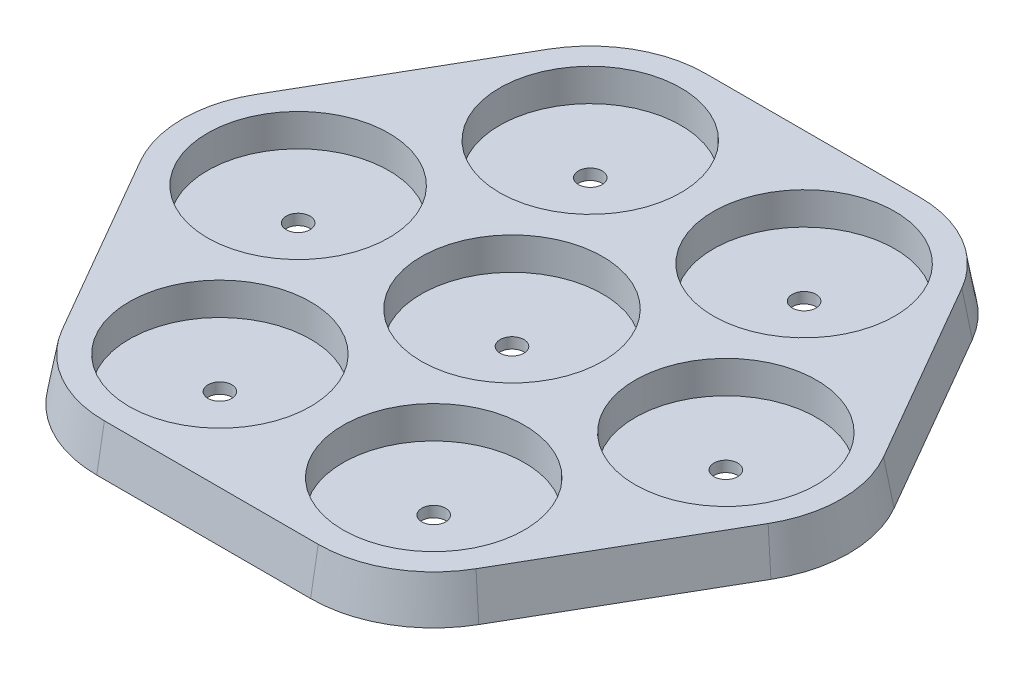
ISO-10303-21;
HEADER;
FILE_DESCRIPTION(('STEP AP214'),'2;1');
FILE_NAME('part.step','',(''),(''),'','','');
FILE_SCHEMA(('AUTOMOTIVE_DESIGN { 1 0 10303 214 1 1 1 1 }'));
ENDSEC;
DATA;
#1=APPLICATION_CONTEXT('core data for automotive mechanical design processes');
#2=APPLICATION_PROTOCOL_DEFINITION('international standard','automotive_design',2000,#1);
#3=PRODUCT_CONTEXT('',#1,'mechanical');
#4=PRODUCT('Part','Part','',(#3));
#5=PRODUCT_RELATED_PRODUCT_CATEGORY('part','',(#4));
#6=PRODUCT_DEFINITION_FORMATION('','',#4);
#7=PRODUCT_DEFINITION_CONTEXT('part definition',#1,'design');
#8=PRODUCT_DEFINITION('design','',#6,#7);
#9=PRODUCT_DEFINITION_SHAPE('','',#8);
#10=(LENGTH_UNIT() NAMED_UNIT(*) SI_UNIT(.MILLI.,.METRE.));
#11=(NAMED_UNIT(*) PLANE_ANGLE_UNIT() SI_UNIT($,.RADIAN.));
#12=(NAMED_UNIT(*) SI_UNIT($,.STERADIAN.) SOLID_ANGLE_UNIT());
#13=UNCERTAINTY_MEASURE_WITH_UNIT(LENGTH_MEASURE(1.E-05),#10,'distance_accuracy_value','');
#14=(GEOMETRIC_REPRESENTATION_CONTEXT(3) GLOBAL_UNCERTAINTY_ASSIGNED_CONTEXT((#13)) GLOBAL_UNIT_ASSIGNED_CONTEXT((#10,
#11,#12)) REPRESENTATION_CONTEXT('',''));
#15=CARTESIAN_POINT('',(0.,0.,0.));
#16=DIRECTION('',(0.,0.,1.));
#17=DIRECTION('',(1.,0.,0.));
#18=AXIS2_PLACEMENT_3D('',#15,#16,#17);
#19=CARTESIAN_POINT('',(-9.90000000000008,0.,17.1473029949318));
#20=DIRECTION('',(0.,1.,0.));
#21=DIRECTION('',(0.,0.,1.));
#22=AXIS2_PLACEMENT_3D('',#19,#20,#21);
#23=CYLINDRICAL_SURFACE('',#22,1.1);
#24=CARTESIAN_POINT('',(-9.90000000000008,0.,17.1473029949318));
#25=DIRECTION('',(0.,1.,0.));
#26=DIRECTION('',(0.,0.,1.));
#27=AXIS2_PLACEMENT_3D('',#24,#25,#26);
#28=CIRCLE('',#27,1.1);
#29=CARTESIAN_POINT('',(-9.90000000000008,0.,18.2473029949318));
#30=VERTEX_POINT('',#29);
#31=EDGE_CURVE('E195',#30,#30,#28,.T.);
#32=ORIENTED_EDGE('',*,*,#31,.F.);
#33=EDGE_LOOP('',(#32));
#34=FACE_BOUND('',#33,.T.);
#35=CARTESIAN_POINT('',(-9.90000000000008,1.,17.1473029949318));
#36=DIRECTION('',(0.,1.,0.));
#37=DIRECTION('',(0.,0.,1.));
#38=AXIS2_PLACEMENT_3D('',#35,#36,#37);
#39=CIRCLE('',#38,1.1);
#40=CARTESIAN_POINT('',(-9.90000000000008,1.,18.2473029949318));
#41=VERTEX_POINT('',#40);
#42=EDGE_CURVE('E914',#41,#41,#39,.T.);
#43=ORIENTED_EDGE('',*,*,#42,.T.);
#44=EDGE_LOOP('',(#43));
#45=FACE_BOUND('',#44,.T.);
#46=ADVANCED_FACE('F83',(#34,#45),#23,.F.);
#47=CARTESIAN_POINT('',(-19.7999999999998,0.,0.));
#48=DIRECTION('',(0.,1.,0.));
#49=DIRECTION('',(0.,0.,1.));
#50=AXIS2_PLACEMENT_3D('',#47,#48,#49);
#51=CYLINDRICAL_SURFACE('',#50,1.10000000000001);
#52=CARTESIAN_POINT('',(-19.7999999999998,0.,0.));
#53=DIRECTION('',(0.,1.,0.));
#54=DIRECTION('',(0.,0.,1.));
#55=AXIS2_PLACEMENT_3D('',#52,#53,#54);
#56=CIRCLE('',#55,1.10000000000001);
#57=CARTESIAN_POINT('',(-19.7999999999998,0.,1.10000000000001));
#58=VERTEX_POINT('',#57);
#59=EDGE_CURVE('E844',#58,#58,#56,.T.);
#60=ORIENTED_EDGE('',*,*,#59,.F.);
#61=EDGE_LOOP('',(#60));
#62=FACE_BOUND('',#61,.T.);
#63=CARTESIAN_POINT('',(-19.7999999999998,1.,0.));
#64=DIRECTION('',(0.,1.,0.));
#65=DIRECTION('',(0.,0.,1.));
#66=AXIS2_PLACEMENT_3D('',#63,#64,#65);
#67=CIRCLE('',#66,1.10000000000001);
#68=CARTESIAN_POINT('',(-19.7999999999998,1.,1.10000000000001));
#69=VERTEX_POINT('',#68);
#70=EDGE_CURVE('E834',#69,#69,#67,.T.);
#71=ORIENTED_EDGE('',*,*,#70,.T.);
#72=EDGE_LOOP('',(#71));
#73=FACE_BOUND('',#72,.T.);
#74=ADVANCED_FACE('F354',(#62,#73),#51,.F.);
#75=CARTESIAN_POINT('',(-29.6999999999994,0.,-17.1473029949317));
#76=DIRECTION('',(0.,1.,0.));
#77=DIRECTION('',(0.,0.,1.));
#78=AXIS2_PLACEMENT_3D('',#75,#76,#77);
#79=CYLINDRICAL_SURFACE('',#78,1.1);
#80=CARTESIAN_POINT('',(-29.6999999999994,0.,-17.1473029949317));
#81=DIRECTION('',(0.,1.,0.));
#82=DIRECTION('',(0.,0.,1.));
#83=AXIS2_PLACEMENT_3D('',#80,#81,#82);
#84=CIRCLE('',#83,1.1);
#85=CARTESIAN_POINT('',(-29.6999999999994,0.,-16.0473029949317));
#86=VERTEX_POINT('',#85);
#87=EDGE_CURVE('E848',#86,#86,#84,.T.);
#88=ORIENTED_EDGE('',*,*,#87,.F.);
#89=EDGE_LOOP('',(#88));
#90=FACE_BOUND('',#89,.T.);
#91=CARTESIAN_POINT('',(-29.6999999999994,1.,-17.1473029949317));
#92=DIRECTION('',(0.,1.,0.));
#93=DIRECTION('',(0.,0.,1.));
#94=AXIS2_PLACEMENT_3D('',#91,#92,#93);
#95=CIRCLE('',#94,1.1);
#96=CARTESIAN_POINT('',(-29.6999999999994,1.,-16.0473029949317));
#97=VERTEX_POINT('',#96);
#98=EDGE_CURVE('E827',#97,#97,#95,.T.);
#99=ORIENTED_EDGE('',*,*,#98,.T.);
#100=EDGE_LOOP('',(#99));
#101=FACE_BOUND('',#100,.T.);
#102=ADVANCED_FACE('F360',(#90,#101),#79,.F.);
#103=CARTESIAN_POINT('',(0.,0.,0.));
#104=DIRECTION('',(0.,1.,0.));
#105=DIRECTION('',(0.,0.,1.));
#106=AXIS2_PLACEMENT_3D('',#103,#104,#105);
#107=CYLINDRICAL_SURFACE('',#106,1.1);
#108=CARTESIAN_POINT('',(0.,0.,0.));
#109=DIRECTION('',(0.,1.,0.));
#110=DIRECTION('',(0.,0.,1.));
#111=AXIS2_PLACEMENT_3D('',#108,#109,#110);
#112=CIRCLE('',#111,1.1);
#113=CARTESIAN_POINT('',(0.,0.,1.1));
#114=VERTEX_POINT('',#113);
#115=EDGE_CURVE('E199',#114,#114,#112,.T.);
#116=ORIENTED_EDGE('',*,*,#115,.F.);
#117=EDGE_LOOP('',(#116));
#118=FACE_BOUND('',#117,.T.);
#119=CARTESIAN_POINT('',(0.,1.,0.));
#120=DIRECTION('',(0.,1.,0.));
#121=DIRECTION('',(0.,0.,1.));
#122=AXIS2_PLACEMENT_3D('',#119,#120,#121);
#123=CIRCLE('',#122,1.1);
#124=CARTESIAN_POINT('',(0.,1.,1.1));
#125=VERTEX_POINT('',#124);
#126=EDGE_CURVE('E889',#125,#125,#123,.T.);
#127=ORIENTED_EDGE('',*,*,#126,.T.);
#128=EDGE_LOOP('',(#127));
#129=FACE_BOUND('',#128,.T.);
#130=ADVANCED_FACE('F555',(#118,#129),#107,.F.);
#131=CARTESIAN_POINT('',(-29.6999999999999,0.,17.1473029949318));
#132=DIRECTION('',(0.,1.,0.));
#133=DIRECTION('',(0.,0.,1.));
#134=AXIS2_PLACEMENT_3D('',#131,#132,#133);
#135=CYLINDRICAL_SURFACE('',#134,1.1);
#136=CARTESIAN_POINT('',(-29.6999999999999,0.,17.1473029949318));
#137=DIRECTION('',(0.,1.,0.));
#138=DIRECTION('',(0.,0.,1.));
#139=AXIS2_PLACEMENT_3D('',#136,#137,#138);
#140=CIRCLE('',#139,1.1);
#141=CARTESIAN_POINT('',(-29.6999999999999,0.,18.2473029949318));
#142=VERTEX_POINT('',#141);
#143=EDGE_CURVE('E859',#142,#142,#140,.T.);
#144=ORIENTED_EDGE('',*,*,#143,.F.);
#145=EDGE_LOOP('',(#144));
#146=FACE_BOUND('',#145,.T.);
#147=CARTESIAN_POINT('',(-29.6999999999999,1.,17.1473029949318));
#148=DIRECTION('',(0.,1.,0.));
#149=DIRECTION('',(0.,0.,1.));
#150=AXIS2_PLACEMENT_3D('',#147,#148,#149);
#151=CIRCLE('',#150,1.1);
#152=CARTESIAN_POINT('',(-29.6999999999999,1.,18.2473029949318));
#153=VERTEX_POINT('',#152);
#154=EDGE_CURVE('E872',#153,#153,#151,.T.);
#155=ORIENTED_EDGE('',*,*,#154,.T.);
#156=EDGE_LOOP('',(#155));
#157=FACE_BOUND('',#156,.T.);
#158=ADVANCED_FACE('F367',(#146,#157),#135,.F.);
#159=CARTESIAN_POINT('',(-39.5999999999999,0.,-2.72581957005969E-13));
#160=DIRECTION('',(0.,1.,0.));
#161=DIRECTION('',(0.,0.,1.));
#162=AXIS2_PLACEMENT_3D('',#159,#160,#161);
#163=CYLINDRICAL_SURFACE('',#162,1.10000000000001);
#164=CARTESIAN_POINT('',(-39.5999999999999,0.,-2.72581957005969E-13));
#165=DIRECTION('',(0.,1.,0.));
#166=DIRECTION('',(0.,0.,1.));
#167=AXIS2_PLACEMENT_3D('',#164,#165,#166);
#168=CIRCLE('',#167,1.10000000000001);
#169=CARTESIAN_POINT('',(-39.5999999999999,0.,1.09999999999974));
#170=VERTEX_POINT('',#169);
#171=EDGE_CURVE('E855',#170,#170,#168,.T.);
#172=ORIENTED_EDGE('',*,*,#171,.F.);
#173=EDGE_LOOP('',(#172));
#174=FACE_BOUND('',#173,.T.);
#175=CARTESIAN_POINT('',(-39.5999999999999,1.,-2.72581957005969E-13));
#176=DIRECTION('',(0.,1.,0.));
#177=DIRECTION('',(0.,0.,1.));
#178=AXIS2_PLACEMENT_3D('',#175,#176,#177);
#179=CIRCLE('',#178,1.10000000000001);
#180=CARTESIAN_POINT('',(-39.5999999999999,1.,1.09999999999974));
#181=VERTEX_POINT('',#180);
#182=EDGE_CURVE('E825',#181,#181,#179,.T.);
#183=ORIENTED_EDGE('',*,*,#182,.T.);
#184=EDGE_LOOP('',(#183));
#185=FACE_BOUND('',#184,.T.);
#186=ADVANCED_FACE('F571',(#174,#185),#163,.F.);
#187=CARTESIAN_POINT('',(-9.89999999999992,0.,-17.1473029949316));
#188=DIRECTION('',(0.,1.,0.));
#189=DIRECTION('',(0.,0.,1.));
#190=AXIS2_PLACEMENT_3D('',#187,#188,#189);
#191=CYLINDRICAL_SURFACE('',#190,1.1);
#192=CARTESIAN_POINT('',(-9.89999999999992,0.,-17.1473029949316));
#193=DIRECTION('',(0.,1.,0.));
#194=DIRECTION('',(0.,0.,1.));
#195=AXIS2_PLACEMENT_3D('',#192,#193,#194);
#196=CIRCLE('',#195,1.1);
#197=CARTESIAN_POINT('',(-9.89999999999992,0.,-16.0473029949316));
#198=VERTEX_POINT('',#197);
#199=EDGE_CURVE('E803',#198,#198,#196,.T.);
#200=ORIENTED_EDGE('',*,*,#199,.F.);
#201=EDGE_LOOP('',(#200));
#202=FACE_BOUND('',#201,.T.);
#203=CARTESIAN_POINT('',(-9.89999999999992,1.,-17.1473029949316));
#204=DIRECTION('',(0.,1.,0.));
#205=DIRECTION('',(0.,0.,1.));
#206=AXIS2_PLACEMENT_3D('',#203,#204,#205);
#207=CIRCLE('',#206,1.1);
#208=CARTESIAN_POINT('',(-9.89999999999992,1.,-16.0473029949316));
#209=VERTEX_POINT('',#208);
#210=EDGE_CURVE('E806',#209,#209,#207,.T.);
#211=ORIENTED_EDGE('',*,*,#210,.T.);
#212=EDGE_LOOP('',(#211));
#213=FACE_BOUND('',#212,.T.);
#214=ADVANCED_FACE('F378',(#202,#213),#191,.F.);
#215=CARTESIAN_POINT('',(-39.5999999999999,0.,-2.72581957005969E-13));
#216=DIRECTION('',(0.,-1.,0.));
#217=DIRECTION('',(0.,0.,1.));
#218=AXIS2_PLACEMENT_3D('',#215,#216,#217);
#219=CONICAL_SURFACE('',#218,11.4,0.174532925199433);
#220=CARTESIAN_POINT('',(-39.5999999999999,0.,-2.72581957005969E-13));
#221=DIRECTION('',(0.,1.,0.));
#222=DIRECTION('',(0.,0.,1.));
#223=AXIS2_PLACEMENT_3D('',#220,#221,#222);
#224=CIRCLE('',#223,11.4);
#225=CARTESIAN_POINT('',(-49.4726896031423,0.,-5.70000000000059));
#226=VERTEX_POINT('',#225);
#227=CARTESIAN_POINT('',(-49.4726896031425,0.,5.69999999999964));
#228=VERTEX_POINT('',#227);
#229=EDGE_CURVE('E178',#226,#228,#224,.T.);
#230=ORIENTED_EDGE('',*,*,#229,.T.);
#231=DIRECTION('',(-0.150383733180436,-0.984807753012208,0.086824088833464));
#232=VECTOR('',#231,1.);
#233=CARTESIAN_POINT('',(-49.4726896031425,0.,5.69999999999963));
#234=LINE('',#233,#232);
#235=CARTESIAN_POINT('',(-48.8618750244779,4.,5.3473460385827));
#236=VERTEX_POINT('',#235);
#237=EDGE_CURVE('E12',#236,#228,#234,.T.);
#238=ORIENTED_EDGE('',*,*,#237,.F.);
#239=CARTESIAN_POINT('',(-39.5999999999999,4.,-2.72581957005969E-13));
#240=DIRECTION('',(0.,1.,0.));
#241=DIRECTION('',(0.,0.,1.));
#242=AXIS2_PLACEMENT_3D('',#239,#240,#241);
#243=CIRCLE('',#242,10.6946920771662);
#244=CARTESIAN_POINT('',(-48.8618750244777,4.,-5.34734603858365));
#245=VERTEX_POINT('',#244);
#246=EDGE_CURVE('E235',#245,#236,#243,.T.);
#247=ORIENTED_EDGE('',*,*,#246,.F.);
#248=DIRECTION('',(-0.150383733180433,-0.984807753012208,-0.0868240888334702));
#249=VECTOR('',#248,1.);
#250=CARTESIAN_POINT('',(-49.4726896031423,0.,-5.7000000000006));
#251=LINE('',#250,#249);
#252=EDGE_CURVE('E193',#245,#226,#251,.T.);
#253=ORIENTED_EDGE('',*,*,#252,.T.);
#254=EDGE_LOOP('',(#230,#238,#247,#253));
#255=FACE_BOUND('',#254,.T.);
#256=ADVANCED_FACE('F192',(#255),#219,.T.);
#257=CARTESIAN_POINT('',(-39.5726896031427,0.,22.8473029949315));
#258=DIRECTION('',(-0.852868531952448,0.173648177666931,0.492403876506096));
#259=DIRECTION('',(0.499999999999992,0.,0.866025403784443));
#260=AXIS2_PLACEMENT_3D('',#257,#258,#259);
#261=PLANE('',#260);
#262=DIRECTION('',(0.499999999999992,0.,0.866025403784443));
#263=VECTOR('',#262,1.);
#264=CARTESIAN_POINT('',(-39.5726896031427,0.,22.8473029949315));
#265=LINE('',#264,#263);
#266=CARTESIAN_POINT('',(-39.5726896031426,0.,22.8473029949318));
#267=VERTEX_POINT('',#266);
#268=EDGE_CURVE('E174',#228,#267,#265,.T.);
#269=ORIENTED_EDGE('',*,*,#268,.T.);
#270=DIRECTION('',(-0.150383733180436,-0.984807753012208,0.086824088833464));
#271=VECTOR('',#270,1.);
#272=CARTESIAN_POINT('',(-39.5726896031426,0.,22.8473029949318));
#273=LINE('',#272,#271);
#274=CARTESIAN_POINT('',(-38.961875024478,4.,22.4946490335148));
#275=VERTEX_POINT('',#274);
#276=EDGE_CURVE('E93',#275,#267,#273,.T.);
#277=ORIENTED_EDGE('',*,*,#276,.F.);
#278=DIRECTION('',(-0.499999999999992,0.,-0.866025403784443));
#279=VECTOR('',#278,1.);
#280=CARTESIAN_POINT('',(-38.9618750244782,4.,22.4946490335146));
#281=LINE('',#280,#279);
#282=EDGE_CURVE('E188',#236,#275,#281,.F.);
#283=ORIENTED_EDGE('',*,*,#282,.F.);
#284=ORIENTED_EDGE('',*,*,#237,.T.);
#285=EDGE_LOOP('',(#269,#277,#283,#284));
#286=FACE_BOUND('',#285,.T.);
#287=ADVANCED_FACE('F85',(#286),#261,.T.);
#288=CARTESIAN_POINT('',(-29.6999999999999,0.,17.1473029949318));
#289=DIRECTION('',(0.,-1.,0.));
#290=DIRECTION('',(0.,0.,1.));
#291=AXIS2_PLACEMENT_3D('',#288,#289,#290);
#292=CONICAL_SURFACE('',#291,11.4,0.174532925199433);
#293=CARTESIAN_POINT('',(-29.6999999999999,0.,17.1473029949318));
#294=DIRECTION('',(0.,1.,0.));
#295=DIRECTION('',(0.,0.,1.));
#296=AXIS2_PLACEMENT_3D('',#293,#294,#295);
#297=CIRCLE('',#296,11.4);
#298=CARTESIAN_POINT('',(-29.6999999999999,0.,28.5473029949318));
#299=VERTEX_POINT('',#298);
#300=EDGE_CURVE('E181',#267,#299,#297,.T.);
#301=ORIENTED_EDGE('',*,*,#300,.T.);
#302=DIRECTION('',(0.,-0.984807753012208,0.173648177666931));
#303=VECTOR('',#302,1.);
#304=CARTESIAN_POINT('',(-29.6999999999999,0.,28.5473029949318));
#305=LINE('',#304,#303);
#306=CARTESIAN_POINT('',(-29.6999999999999,4.,27.841995072098));
#307=VERTEX_POINT('',#306);
#308=EDGE_CURVE('E266',#307,#299,#305,.T.);
#309=ORIENTED_EDGE('',*,*,#308,.F.);
#310=CARTESIAN_POINT('',(-29.6999999999999,4.,17.1473029949318));
#311=DIRECTION('',(0.,1.,0.));
#312=DIRECTION('',(0.,0.,1.));
#313=AXIS2_PLACEMENT_3D('',#310,#311,#312);
#314=CIRCLE('',#313,10.6946920771661);
#315=EDGE_CURVE('E275',#275,#307,#314,.T.);
#316=ORIENTED_EDGE('',*,*,#315,.F.);
#317=ORIENTED_EDGE('',*,*,#276,.T.);
#318=EDGE_LOOP('',(#301,#309,#316,#317));
#319=FACE_BOUND('',#318,.T.);
#320=ADVANCED_FACE('F321',(#319),#292,.T.);
#321=CARTESIAN_POINT('',(0.,0.,28.5473029949318));
#322=DIRECTION('',(0.,0.173648177666931,0.984807753012208));
#323=DIRECTION('',(0.,-0.984807753012208,0.173648177666931));
#324=AXIS2_PLACEMENT_3D('',#321,#322,#323);
#325=PLANE('',#324);
#326=DIRECTION('',(-1.,0.,0.));
#327=VECTOR('',#326,1.);
#328=CARTESIAN_POINT('',(0.,0.,28.5473029949318));
#329=LINE('',#328,#327);
#330=CARTESIAN_POINT('',(-9.90000000000008,0.,28.5473029949318));
#331=VERTEX_POINT('',#330);
#332=EDGE_CURVE('E205',#331,#299,#329,.T.);
#333=ORIENTED_EDGE('',*,*,#332,.F.);
#334=DIRECTION('',(0.,-0.984807753012208,0.173648177666931));
#335=VECTOR('',#334,1.);
#336=CARTESIAN_POINT('',(-9.90000000000008,0.,28.5473029949318));
#337=LINE('',#336,#335);
#338=CARTESIAN_POINT('',(-9.90000000000008,4.,27.841995072098));
#339=VERTEX_POINT('',#338);
#340=EDGE_CURVE('E263',#339,#331,#337,.T.);
#341=ORIENTED_EDGE('',*,*,#340,.F.);
#342=DIRECTION('',(-1.,0.,0.));
#343=VECTOR('',#342,1.);
#344=CARTESIAN_POINT('',(0.,4.,27.841995072098));
#345=LINE('',#344,#343);
#346=EDGE_CURVE('E278',#339,#307,#345,.T.);
#347=ORIENTED_EDGE('',*,*,#346,.T.);
#348=ORIENTED_EDGE('',*,*,#308,.T.);
#349=EDGE_LOOP('',(#333,#341,#347,#348));
#350=FACE_BOUND('',#349,.T.);
#351=ADVANCED_FACE('F324',(#350),#325,.T.);
#352=CARTESIAN_POINT('',(-9.90000000000008,0.,17.1473029949318));
#353=DIRECTION('',(0.,-1.,0.));
#354=DIRECTION('',(0.,0.,1.));
#355=AXIS2_PLACEMENT_3D('',#352,#353,#354);
#356=CONICAL_SURFACE('',#355,11.4,0.174532925199433);
#357=CARTESIAN_POINT('',(-9.90000000000008,0.,17.1473029949318));
#358=DIRECTION('',(0.,1.,0.));
#359=DIRECTION('',(0.,0.,1.));
#360=AXIS2_PLACEMENT_3D('',#357,#358,#359);
#361=CIRCLE('',#360,11.4);
#362=CARTESIAN_POINT('',(-0.0273103968575087,0.,22.8473029949319));
#363=VERTEX_POINT('',#362);
#364=EDGE_CURVE('E208',#331,#363,#361,.T.);
#365=ORIENTED_EDGE('',*,*,#364,.T.);
#366=DIRECTION('',(0.150383733180435,-0.984807753012208,0.0868240888334661));
#367=VECTOR('',#366,1.);
#368=CARTESIAN_POINT('',(-0.0273103968575079,0.,22.8473029949319));
#369=LINE('',#368,#367);
#370=CARTESIAN_POINT('',(-0.638124975522065,4.,22.494649033515));
#371=VERTEX_POINT('',#370);
#372=EDGE_CURVE('E260',#371,#363,#369,.T.);
#373=ORIENTED_EDGE('',*,*,#372,.F.);
#374=CARTESIAN_POINT('',(-9.90000000000008,4.,17.1473029949318));
#375=DIRECTION('',(0.,1.,0.));
#376=DIRECTION('',(0.,0.,1.));
#377=AXIS2_PLACEMENT_3D('',#374,#375,#376);
#378=CIRCLE('',#377,10.6946920771661);
#379=EDGE_CURVE('E282',#339,#371,#378,.T.);
#380=ORIENTED_EDGE('',*,*,#379,.F.);
#381=ORIENTED_EDGE('',*,*,#340,.T.);
#382=EDGE_LOOP('',(#365,#373,#380,#381));
#383=FACE_BOUND('',#382,.T.);
#384=ADVANCED_FACE('F329',(#383),#356,.T.);
#385=CARTESIAN_POINT('',(9.87268960314258,0.,5.70000000000005));
#386=DIRECTION('',(0.852868531952441,0.173648177666931,0.492403876506108));
#387=DIRECTION('',(0.500000000000004,0.,-0.866025403784436));
#388=AXIS2_PLACEMENT_3D('',#385,#386,#387);
#389=PLANE('',#388);
#390=DIRECTION('',(-0.500000000000004,0.,0.866025403784436));
#391=VECTOR('',#390,1.);
#392=CARTESIAN_POINT('',(9.87268960314258,0.,5.70000000000005));
#393=LINE('',#392,#391);
#394=CARTESIAN_POINT('',(9.87268960314258,0.,5.70000000000005));
#395=VERTEX_POINT('',#394);
#396=EDGE_CURVE('E212',#395,#363,#393,.T.);
#397=ORIENTED_EDGE('',*,*,#396,.F.);
#398=DIRECTION('',(0.150383733180435,-0.984807753012208,0.0868240888334661));
#399=VECTOR('',#398,1.);
#400=CARTESIAN_POINT('',(9.87268960314258,0.,5.70000000000004));
#401=LINE('',#400,#399);
#402=CARTESIAN_POINT('',(9.26187502447802,4.,5.34734603858311));
#403=VERTEX_POINT('',#402);
#404=EDGE_CURVE('E257',#403,#395,#401,.T.);
#405=ORIENTED_EDGE('',*,*,#404,.F.);
#406=DIRECTION('',(-0.500000000000004,0.,0.866025403784436));
#407=VECTOR('',#406,1.);
#408=CARTESIAN_POINT('',(9.26187502447802,4.,5.34734603858312));
#409=LINE('',#408,#407);
#410=EDGE_CURVE('E285',#403,#371,#409,.T.);
#411=ORIENTED_EDGE('',*,*,#410,.T.);
#412=ORIENTED_EDGE('',*,*,#372,.T.);
#413=EDGE_LOOP('',(#397,#405,#411,#412));
#414=FACE_BOUND('',#413,.T.);
#415=ADVANCED_FACE('F333',(#414),#389,.T.);
#416=CARTESIAN_POINT('',(0.,0.,0.));
#417=DIRECTION('',(0.,-1.,0.));
#418=DIRECTION('',(0.,0.,1.));
#419=AXIS2_PLACEMENT_3D('',#416,#417,#418);
#420=CONICAL_SURFACE('',#419,11.4,0.174532925199433);
#421=CARTESIAN_POINT('',(0.,0.,0.));
#422=DIRECTION('',(0.,1.,0.));
#423=DIRECTION('',(0.,0.,1.));
#424=AXIS2_PLACEMENT_3D('',#421,#422,#423);
#425=CIRCLE('',#424,11.4);
#426=CARTESIAN_POINT('',(9.87268960314257,0.,-5.70000000000005));
#427=VERTEX_POINT('',#426);
#428=EDGE_CURVE('E216',#395,#427,#425,.T.);
#429=ORIENTED_EDGE('',*,*,#428,.T.);
#430=DIRECTION('',(0.150383733180435,-0.984807753012208,-0.0868240888334661));
#431=VECTOR('',#430,1.);
#432=CARTESIAN_POINT('',(9.87268960314257,0.,-5.70000000000005));
#433=LINE('',#432,#431);
#434=CARTESIAN_POINT('',(9.26187502447801,4.,-5.34734603858311));
#435=VERTEX_POINT('',#434);
#436=EDGE_CURVE('E254',#435,#427,#433,.T.);
#437=ORIENTED_EDGE('',*,*,#436,.F.);
#438=CARTESIAN_POINT('',(0.,4.,0.));
#439=DIRECTION('',(0.,1.,0.));
#440=DIRECTION('',(0.,0.,1.));
#441=AXIS2_PLACEMENT_3D('',#438,#439,#440);
#442=CIRCLE('',#441,10.6946920771661);
#443=EDGE_CURVE('E289',#403,#435,#442,.T.);
#444=ORIENTED_EDGE('',*,*,#443,.F.);
#445=ORIENTED_EDGE('',*,*,#404,.T.);
#446=EDGE_LOOP('',(#429,#437,#444,#445));
#447=FACE_BOUND('',#446,.T.);
#448=ADVANCED_FACE('F338',(#447),#420,.T.);
#449=CARTESIAN_POINT('',(9.87268960314257,0.,-5.70000000000005));
#450=DIRECTION('',(0.852868531952441,0.173648177666931,-0.492403876506108));
#451=DIRECTION('',(-0.500000000000004,0.,-0.866025403784436));
#452=AXIS2_PLACEMENT_3D('',#449,#450,#451);
#453=PLANE('',#452);
#454=DIRECTION('',(0.500000000000004,0.,0.866025403784436));
#455=VECTOR('',#454,1.);
#456=CARTESIAN_POINT('',(9.87268960314257,0.,-5.70000000000005));
#457=LINE('',#456,#455);
#458=CARTESIAN_POINT('',(-0.0273103968573551,0.,-22.8473029949316));
#459=VERTEX_POINT('',#458);
#460=EDGE_CURVE('E220',#459,#427,#457,.T.);
#461=ORIENTED_EDGE('',*,*,#460,.F.);
#462=DIRECTION('',(0.150383733180435,-0.984807753012208,-0.0868240888334661));
#463=VECTOR('',#462,1.);
#464=CARTESIAN_POINT('',(-0.0273103968573551,0.,-22.8473029949316));
#465=LINE('',#464,#463);
#466=CARTESIAN_POINT('',(-0.638124975521912,4.,-22.4946490335147));
#467=VERTEX_POINT('',#466);
#468=EDGE_CURVE('E251',#467,#459,#465,.T.);
#469=ORIENTED_EDGE('',*,*,#468,.F.);
#470=DIRECTION('',(0.500000000000004,0.,0.866025403784436));
#471=VECTOR('',#470,1.);
#472=CARTESIAN_POINT('',(9.26187502447801,4.,-5.34734603858311));
#473=LINE('',#472,#471);
#474=EDGE_CURVE('E292',#467,#435,#473,.T.);
#475=ORIENTED_EDGE('',*,*,#474,.T.);
#476=ORIENTED_EDGE('',*,*,#436,.T.);
#477=EDGE_LOOP('',(#461,#469,#475,#476));
#478=FACE_BOUND('',#477,.T.);
#479=ADVANCED_FACE('F341',(#478),#453,.T.);
#480=CARTESIAN_POINT('',(-9.89999999999992,0.,-17.1473029949316));
#481=DIRECTION('',(0.,-1.,0.));
#482=DIRECTION('',(0.,0.,1.));
#483=AXIS2_PLACEMENT_3D('',#480,#481,#482);
#484=CONICAL_SURFACE('',#483,11.4,0.174532925199433);
#485=CARTESIAN_POINT('',(-9.89999999999992,0.,-17.1473029949316));
#486=DIRECTION('',(0.,1.,0.));
#487=DIRECTION('',(0.,0.,1.));
#488=AXIS2_PLACEMENT_3D('',#485,#486,#487);
#489=CIRCLE('',#488,11.4);
#490=CARTESIAN_POINT('',(-9.89999999999992,0.,-28.5473029949316));
#491=VERTEX_POINT('',#490);
#492=EDGE_CURVE('E224',#459,#491,#489,.T.);
#493=ORIENTED_EDGE('',*,*,#492,.T.);
#494=DIRECTION('',(0.,-0.984807753012208,-0.173648177666931));
#495=VECTOR('',#494,1.);
#496=CARTESIAN_POINT('',(-9.89999999999992,0.,-28.5473029949316));
#497=LINE('',#496,#495);
#498=CARTESIAN_POINT('',(-9.89999999999993,4.,-27.8419950720977));
#499=VERTEX_POINT('',#498);
#500=EDGE_CURVE('E247',#499,#491,#497,.T.);
#501=ORIENTED_EDGE('',*,*,#500,.F.);
#502=CARTESIAN_POINT('',(-9.89999999999992,4.,-17.1473029949316));
#503=DIRECTION('',(0.,1.,0.));
#504=DIRECTION('',(0.,0.,1.));
#505=AXIS2_PLACEMENT_3D('',#502,#503,#504);
#506=CIRCLE('',#505,10.6946920771661);
#507=EDGE_CURVE('E296',#467,#499,#506,.T.);
#508=ORIENTED_EDGE('',*,*,#507,.F.);
#509=ORIENTED_EDGE('',*,*,#468,.T.);
#510=EDGE_LOOP('',(#493,#501,#508,#509));
#511=FACE_BOUND('',#510,.T.);
#512=ADVANCED_FACE('F344',(#511),#484,.T.);
#513=CARTESIAN_POINT('',(2.20096340805031E-13,0.,-28.5473029949315));
#514=DIRECTION('',(0.,0.173648177666931,-0.984807753012208));
#515=DIRECTION('',(0.,0.984807753012208,0.173648177666931));
#516=AXIS2_PLACEMENT_3D('',#513,#514,#515);
#517=PLANE('',#516);
#518=DIRECTION('',(-1.,0.,0.));
#519=VECTOR('',#518,1.);
#520=CARTESIAN_POINT('',(2.20096340805031E-13,0.,-28.5473029949315));
#521=LINE('',#520,#519);
#522=CARTESIAN_POINT('',(-29.6999999999994,0.,-28.5473029949317));
#523=VERTEX_POINT('',#522);
#524=EDGE_CURVE('E227',#491,#523,#521,.T.);
#525=ORIENTED_EDGE('',*,*,#524,.T.);
#526=DIRECTION('',(0.,-0.984807753012208,-0.173648177666931));
#527=VECTOR('',#526,1.);
#528=CARTESIAN_POINT('',(-29.6999999999994,0.,-28.5473029949317));
#529=LINE('',#528,#527);
#530=CARTESIAN_POINT('',(-29.6999999999994,4.,-27.8419950720978));
#531=VERTEX_POINT('',#530);
#532=EDGE_CURVE('E243',#531,#523,#529,.T.);
#533=ORIENTED_EDGE('',*,*,#532,.F.);
#534=DIRECTION('',(1.,0.,0.));
#535=VECTOR('',#534,1.);
#536=CARTESIAN_POINT('',(2.14658499864887E-13,4.,-27.8419950720976));
#537=LINE('',#536,#535);
#538=EDGE_CURVE('E299',#499,#531,#537,.F.);
#539=ORIENTED_EDGE('',*,*,#538,.F.);
#540=ORIENTED_EDGE('',*,*,#500,.T.);
#541=EDGE_LOOP('',(#525,#533,#539,#540));
#542=FACE_BOUND('',#541,.T.);
#543=ADVANCED_FACE('F310',(#542),#517,.T.);
#544=CARTESIAN_POINT('',(-29.6999999999994,0.,-17.1473029949317));
#545=DIRECTION('',(0.,-1.,0.));
#546=DIRECTION('',(0.,0.,1.));
#547=AXIS2_PLACEMENT_3D('',#544,#545,#546);
#548=CONICAL_SURFACE('',#547,11.4,0.174532925199433);
#549=CARTESIAN_POINT('',(-29.6999999999994,0.,-17.1473029949317));
#550=DIRECTION('',(0.,1.,0.));
#551=DIRECTION('',(0.,0.,1.));
#552=AXIS2_PLACEMENT_3D('',#549,#550,#551);
#553=CIRCLE('',#552,11.4);
#554=CARTESIAN_POINT('',(-39.5726896031418,0.,-22.847302994932));
#555=VERTEX_POINT('',#554);
#556=EDGE_CURVE('E230',#523,#555,#553,.T.);
#557=ORIENTED_EDGE('',*,*,#556,.T.);
#558=DIRECTION('',(-0.150383733180433,-0.984807753012208,-0.0868240888334703));
#559=VECTOR('',#558,1.);
#560=CARTESIAN_POINT('',(-39.5726896031418,0.,-22.847302994932));
#561=LINE('',#560,#559);
#562=CARTESIAN_POINT('',(-38.9618750244772,4.,-22.4946490335151));
#563=VERTEX_POINT('',#562);
#564=EDGE_CURVE('E239',#563,#555,#561,.T.);
#565=ORIENTED_EDGE('',*,*,#564,.F.);
#566=CARTESIAN_POINT('',(-29.6999999999994,4.,-17.1473029949317));
#567=DIRECTION('',(0.,1.,0.));
#568=DIRECTION('',(0.,0.,1.));
#569=AXIS2_PLACEMENT_3D('',#566,#567,#568);
#570=CIRCLE('',#569,10.6946920771661);
#571=EDGE_CURVE('E105',#531,#563,#570,.T.);
#572=ORIENTED_EDGE('',*,*,#571,.F.);
#573=ORIENTED_EDGE('',*,*,#532,.T.);
#574=EDGE_LOOP('',(#557,#565,#572,#573));
#575=FACE_BOUND('',#574,.T.);
#576=ADVANCED_FACE('F314',(#575),#548,.T.);
#577=CARTESIAN_POINT('',(-39.5726896031413,0.,-22.8473029949329));
#578=DIRECTION('',(-0.852868531952427,0.173648177666931,-0.492403876506132));
#579=DIRECTION('',(-0.500000000000028,0.,0.866025403784422));
#580=AXIS2_PLACEMENT_3D('',#577,#578,#579);
#581=PLANE('',#580);
#582=DIRECTION('',(-0.500000000000028,0.,0.866025403784422));
#583=VECTOR('',#582,1.);
#584=CARTESIAN_POINT('',(-39.5726896031413,0.,-22.8473029949329));
#585=LINE('',#584,#583);
#586=EDGE_CURVE('E233',#555,#226,#585,.T.);
#587=ORIENTED_EDGE('',*,*,#586,.T.);
#588=ORIENTED_EDGE('',*,*,#252,.F.);
#589=DIRECTION('',(0.500000000000028,0.,-0.866025403784422));
#590=VECTOR('',#589,1.);
#591=CARTESIAN_POINT('',(-38.9618750244768,4.,-22.4946490335159));
#592=LINE('',#591,#590);
#593=EDGE_CURVE('E87',#563,#245,#592,.F.);
#594=ORIENTED_EDGE('',*,*,#593,.F.);
#595=ORIENTED_EDGE('',*,*,#564,.T.);
#596=EDGE_LOOP('',(#587,#588,#594,#595));
#597=FACE_BOUND('',#596,.T.);
#598=ADVANCED_FACE('F316',(#597),#581,.T.);
#599=CARTESIAN_POINT('',(0.,4.,0.));
#600=DIRECTION('',(0.,1.,0.));
#601=DIRECTION('',(0.,0.,1.));
#602=AXIS2_PLACEMENT_3D('',#599,#600,#601);
#603=PLANE('',#602);
#604=CARTESIAN_POINT('',(-29.6999999999994,4.,-17.1473029949317));
#605=DIRECTION('',(0.,1.,0.));
#606=DIRECTION('',(0.,0.,1.));
#607=AXIS2_PLACEMENT_3D('',#604,#605,#606);
#608=CIRCLE('',#607,8.39999999999999);
#609=CARTESIAN_POINT('',(-29.6999999999994,4.,-8.74730299493172));
#610=VERTEX_POINT('',#609);
#611=EDGE_CURVE('E817',#610,#610,#608,.T.);
#612=ORIENTED_EDGE('',*,*,#611,.F.);
#613=EDGE_LOOP('',(#612));
#614=FACE_BOUND('',#613,.T.);
#615=CARTESIAN_POINT('',(-9.89999999999992,4.,-17.1473029949316));
#616=DIRECTION('',(0.,1.,0.));
#617=DIRECTION('',(0.,0.,1.));
#618=AXIS2_PLACEMENT_3D('',#615,#616,#617);
#619=CIRCLE('',#618,8.4);
#620=CARTESIAN_POINT('',(-9.89999999999992,4.,-8.74730299493156));
#621=VERTEX_POINT('',#620);
#622=EDGE_CURVE('E808',#621,#621,#619,.T.);
#623=ORIENTED_EDGE('',*,*,#622,.F.);
#624=EDGE_LOOP('',(#623));
#625=FACE_BOUND('',#624,.T.);
#626=CARTESIAN_POINT('',(-39.5999999999999,4.,-2.72581957005969E-13));
#627=DIRECTION('',(0.,1.,0.));
#628=DIRECTION('',(0.,0.,1.));
#629=AXIS2_PLACEMENT_3D('',#626,#627,#628);
#630=CIRCLE('',#629,8.40000000000002);
#631=CARTESIAN_POINT('',(-39.5999999999999,4.,8.39999999999974));
#632=VERTEX_POINT('',#631);
#633=EDGE_CURVE('E821',#632,#632,#630,.T.);
#634=ORIENTED_EDGE('',*,*,#633,.F.);
#635=EDGE_LOOP('',(#634));
#636=FACE_BOUND('',#635,.T.);
#637=CARTESIAN_POINT('',(-29.6999999999999,4.,17.1473029949318));
#638=DIRECTION('',(0.,1.,0.));
#639=DIRECTION('',(0.,0.,1.));
#640=AXIS2_PLACEMENT_3D('',#637,#638,#639);
#641=CIRCLE('',#640,8.4);
#642=CARTESIAN_POINT('',(-29.6999999999999,4.,25.5473029949318));
#643=VERTEX_POINT('',#642);
#644=EDGE_CURVE('E874',#643,#643,#641,.T.);
#645=ORIENTED_EDGE('',*,*,#644,.F.);
#646=EDGE_LOOP('',(#645));
#647=FACE_BOUND('',#646,.T.);
#648=CARTESIAN_POINT('',(0.,4.,0.));
#649=DIRECTION('',(0.,1.,0.));
#650=DIRECTION('',(0.,0.,1.));
#651=AXIS2_PLACEMENT_3D('',#648,#649,#650);
#652=CIRCLE('',#651,8.4);
#653=CARTESIAN_POINT('',(0.,4.,8.4));
#654=VERTEX_POINT('',#653);
#655=EDGE_CURVE('E885',#654,#654,#652,.T.);
#656=ORIENTED_EDGE('',*,*,#655,.F.);
#657=EDGE_LOOP('',(#656));
#658=FACE_BOUND('',#657,.T.);
#659=CARTESIAN_POINT('',(-9.90000000000008,4.,17.1473029949318));
#660=DIRECTION('',(0.,1.,0.));
#661=DIRECTION('',(0.,0.,1.));
#662=AXIS2_PLACEMENT_3D('',#659,#660,#661);
#663=CIRCLE('',#662,8.4);
#664=CARTESIAN_POINT('',(-9.90000000000008,4.,25.5473029949318));
#665=VERTEX_POINT('',#664);
#666=EDGE_CURVE('E909',#665,#665,#663,.T.);
#667=ORIENTED_EDGE('',*,*,#666,.F.);
#668=EDGE_LOOP('',(#667));
#669=FACE_BOUND('',#668,.T.);
#670=CARTESIAN_POINT('',(-19.7999999999998,4.,0.));
#671=DIRECTION('',(0.,1.,0.));
#672=DIRECTION('',(0.,0.,1.));
#673=AXIS2_PLACEMENT_3D('',#670,#671,#672);
#674=CIRCLE('',#673,8.40000000000001);
#675=CARTESIAN_POINT('',(-19.7999999999998,4.,8.40000000000001));
#676=VERTEX_POINT('',#675);
#677=EDGE_CURVE('E838',#676,#676,#674,.T.);
#678=ORIENTED_EDGE('',*,*,#677,.F.);
#679=EDGE_LOOP('',(#678));
#680=FACE_BOUND('',#679,.T.);
#681=ORIENTED_EDGE('',*,*,#246,.T.);
#682=ORIENTED_EDGE('',*,*,#282,.T.);
#683=ORIENTED_EDGE('',*,*,#315,.T.);
#684=ORIENTED_EDGE('',*,*,#346,.F.);
#685=ORIENTED_EDGE('',*,*,#379,.T.);
#686=ORIENTED_EDGE('',*,*,#410,.F.);
#687=ORIENTED_EDGE('',*,*,#443,.T.);
#688=ORIENTED_EDGE('',*,*,#474,.F.);
#689=ORIENTED_EDGE('',*,*,#507,.T.);
#690=ORIENTED_EDGE('',*,*,#538,.T.);
#691=ORIENTED_EDGE('',*,*,#571,.T.);
#692=ORIENTED_EDGE('',*,*,#593,.T.);
#693=EDGE_LOOP('',(#681,#682,#683,#684,#685,#686,#687,#688,#689,#690,#691,#692));
#694=FACE_BOUND('',#693,.T.);
#695=ADVANCED_FACE('F305',(#614,#625,#636,#647,#658,#669,#680,#694),#603,.T.);
#696=CARTESIAN_POINT('',(0.,0.,0.));
#697=DIRECTION('',(0.,1.,0.));
#698=DIRECTION('',(0.,0.,1.));
#699=AXIS2_PLACEMENT_3D('',#696,#697,#698);
#700=PLANE('',#699);
#701=ORIENTED_EDGE('',*,*,#199,.T.);
#702=EDGE_LOOP('',(#701));
#703=FACE_BOUND('',#702,.T.);
#704=ORIENTED_EDGE('',*,*,#171,.T.);
#705=EDGE_LOOP('',(#704));
#706=FACE_BOUND('',#705,.T.);
#707=ORIENTED_EDGE('',*,*,#143,.T.);
#708=EDGE_LOOP('',(#707));
#709=FACE_BOUND('',#708,.T.);
#710=ORIENTED_EDGE('',*,*,#115,.T.);
#711=EDGE_LOOP('',(#710));
#712=FACE_BOUND('',#711,.T.);
#713=ORIENTED_EDGE('',*,*,#87,.T.);
#714=EDGE_LOOP('',(#713));
#715=FACE_BOUND('',#714,.T.);
#716=ORIENTED_EDGE('',*,*,#59,.T.);
#717=EDGE_LOOP('',(#716));
#718=FACE_BOUND('',#717,.T.);
#719=ORIENTED_EDGE('',*,*,#31,.T.);
#720=EDGE_LOOP('',(#719));
#721=FACE_BOUND('',#720,.T.);
#722=ORIENTED_EDGE('',*,*,#229,.F.);
#723=ORIENTED_EDGE('',*,*,#586,.F.);
#724=ORIENTED_EDGE('',*,*,#556,.F.);
#725=ORIENTED_EDGE('',*,*,#524,.F.);
#726=ORIENTED_EDGE('',*,*,#492,.F.);
#727=ORIENTED_EDGE('',*,*,#460,.T.);
#728=ORIENTED_EDGE('',*,*,#428,.F.);
#729=ORIENTED_EDGE('',*,*,#396,.T.);
#730=ORIENTED_EDGE('',*,*,#364,.F.);
#731=ORIENTED_EDGE('',*,*,#332,.T.);
#732=ORIENTED_EDGE('',*,*,#300,.F.);
#733=ORIENTED_EDGE('',*,*,#268,.F.);
#734=EDGE_LOOP('',(#722,#723,#724,#725,#726,#727,#728,#729,#730,#731,#732,#733));
#735=FACE_BOUND('',#734,.T.);
#736=ADVANCED_FACE('F175',(#703,#706,#709,#712,#715,#718,#721,#735),#700,.F.);
#737=CARTESIAN_POINT('',(-9.89999999999992,1.,-17.1473029949316));
#738=DIRECTION('',(0.,1.,0.));
#739=DIRECTION('',(0.,0.,1.));
#740=AXIS2_PLACEMENT_3D('',#737,#738,#739);
#741=CYLINDRICAL_SURFACE('',#740,8.4);
#742=CARTESIAN_POINT('',(-9.89999999999992,1.,-17.1473029949316));
#743=DIRECTION('',(0.,1.,0.));
#744=DIRECTION('',(0.,0.,1.));
#745=AXIS2_PLACEMENT_3D('',#742,#743,#744);
#746=CIRCLE('',#745,8.4);
#747=CARTESIAN_POINT('',(-9.89999999999992,1.,-8.74730299493156));
#748=VERTEX_POINT('',#747);
#749=EDGE_CURVE('E814',#748,#748,#746,.T.);
#750=ORIENTED_EDGE('',*,*,#749,.F.);
#751=EDGE_LOOP('',(#750));
#752=FACE_BOUND('',#751,.T.);
#753=ORIENTED_EDGE('',*,*,#622,.T.);
#754=EDGE_LOOP('',(#753));
#755=FACE_BOUND('',#754,.T.);
#756=ADVANCED_FACE('F374',(#752,#755),#741,.F.);
#757=CARTESIAN_POINT('',(-9.89999999999992,1.,-17.1473029949316));
#758=DIRECTION('',(0.,1.,0.));
#759=DIRECTION('',(0.,0.,1.));
#760=AXIS2_PLACEMENT_3D('',#757,#758,#759);
#761=PLANE('',#760);
#762=ORIENTED_EDGE('',*,*,#210,.F.);
#763=EDGE_LOOP('',(#762));
#764=FACE_BOUND('',#763,.T.);
#765=ORIENTED_EDGE('',*,*,#749,.T.);
#766=EDGE_LOOP('',(#765));
#767=FACE_BOUND('',#766,.T.);
#768=ADVANCED_FACE('F405',(#764,#767),#761,.T.);
#769=CARTESIAN_POINT('',(-39.5999999999999,1.,-2.72581957005969E-13));
#770=DIRECTION('',(0.,1.,0.));
#771=DIRECTION('',(0.,0.,1.));
#772=AXIS2_PLACEMENT_3D('',#769,#770,#771);
#773=CYLINDRICAL_SURFACE('',#772,8.40000000000002);
#774=CARTESIAN_POINT('',(-39.5999999999999,1.,-2.72581957005969E-13));
#775=DIRECTION('',(0.,1.,0.));
#776=DIRECTION('',(0.,0.,1.));
#777=AXIS2_PLACEMENT_3D('',#774,#775,#776);
#778=CIRCLE('',#777,8.40000000000002);
#779=CARTESIAN_POINT('',(-39.5999999999999,1.,8.39999999999974));
#780=VERTEX_POINT('',#779);
#781=EDGE_CURVE('E875',#780,#780,#778,.T.);
#782=ORIENTED_EDGE('',*,*,#781,.F.);
#783=EDGE_LOOP('',(#782));
#784=FACE_BOUND('',#783,.T.);
#785=ORIENTED_EDGE('',*,*,#633,.T.);
#786=EDGE_LOOP('',(#785));
#787=FACE_BOUND('',#786,.T.);
#788=ADVANCED_FACE('F413',(#784,#787),#773,.F.);
#789=CARTESIAN_POINT('',(-39.5999999999999,1.,-2.72581957005969E-13));
#790=DIRECTION('',(0.,1.,0.));
#791=DIRECTION('',(0.,0.,1.));
#792=AXIS2_PLACEMENT_3D('',#789,#790,#791);
#793=PLANE('',#792);
#794=ORIENTED_EDGE('',*,*,#182,.F.);
#795=EDGE_LOOP('',(#794));
#796=FACE_BOUND('',#795,.T.);
#797=ORIENTED_EDGE('',*,*,#781,.T.);
#798=EDGE_LOOP('',(#797));
#799=FACE_BOUND('',#798,.T.);
#800=ADVANCED_FACE('F421',(#796,#799),#793,.T.);
#801=CARTESIAN_POINT('',(-29.6999999999999,1.,17.1473029949318));
#802=DIRECTION('',(0.,1.,0.));
#803=DIRECTION('',(0.,0.,1.));
#804=AXIS2_PLACEMENT_3D('',#801,#802,#803);
#805=CYLINDRICAL_SURFACE('',#804,8.4);
#806=CARTESIAN_POINT('',(-29.6999999999999,1.,17.1473029949318));
#807=DIRECTION('',(0.,1.,0.));
#808=DIRECTION('',(0.,0.,1.));
#809=AXIS2_PLACEMENT_3D('',#806,#807,#808);
#810=CIRCLE('',#809,8.4);
#811=CARTESIAN_POINT('',(-29.6999999999999,1.,25.5473029949318));
#812=VERTEX_POINT('',#811);
#813=EDGE_CURVE('E880',#812,#812,#810,.T.);
#814=ORIENTED_EDGE('',*,*,#813,.F.);
#815=EDGE_LOOP('',(#814));
#816=FACE_BOUND('',#815,.T.);
#817=ORIENTED_EDGE('',*,*,#644,.T.);
#818=EDGE_LOOP('',(#817));
#819=FACE_BOUND('',#818,.T.);
#820=ADVANCED_FACE('F429',(#816,#819),#805,.F.);
#821=CARTESIAN_POINT('',(-29.6999999999999,1.,17.1473029949318));
#822=DIRECTION('',(0.,1.,0.));
#823=DIRECTION('',(0.,0.,1.));
#824=AXIS2_PLACEMENT_3D('',#821,#822,#823);
#825=PLANE('',#824);
#826=ORIENTED_EDGE('',*,*,#154,.F.);
#827=EDGE_LOOP('',(#826));
#828=FACE_BOUND('',#827,.T.);
#829=ORIENTED_EDGE('',*,*,#813,.T.);
#830=EDGE_LOOP('',(#829));
#831=FACE_BOUND('',#830,.T.);
#832=ADVANCED_FACE('F437',(#828,#831),#825,.T.);
#833=CARTESIAN_POINT('',(0.,1.,0.));
#834=DIRECTION('',(0.,1.,0.));
#835=DIRECTION('',(0.,0.,1.));
#836=AXIS2_PLACEMENT_3D('',#833,#834,#835);
#837=CYLINDRICAL_SURFACE('',#836,8.4);
#838=CARTESIAN_POINT('',(0.,1.,0.));
#839=DIRECTION('',(0.,1.,0.));
#840=DIRECTION('',(0.,0.,1.));
#841=AXIS2_PLACEMENT_3D('',#838,#839,#840);
#842=CIRCLE('',#841,8.4);
#843=CARTESIAN_POINT('',(0.,1.,8.4));
#844=VERTEX_POINT('',#843);
#845=EDGE_CURVE('E921',#844,#844,#842,.T.);
#846=ORIENTED_EDGE('',*,*,#845,.F.);
#847=EDGE_LOOP('',(#846));
#848=FACE_BOUND('',#847,.T.);
#849=ORIENTED_EDGE('',*,*,#655,.T.);
#850=EDGE_LOOP('',(#849));
#851=FACE_BOUND('',#850,.T.);
#852=ADVANCED_FACE('F445',(#848,#851),#837,.F.);
#853=CARTESIAN_POINT('',(0.,1.,0.));
#854=DIRECTION('',(0.,1.,0.));
#855=DIRECTION('',(0.,0.,1.));
#856=AXIS2_PLACEMENT_3D('',#853,#854,#855);
#857=PLANE('',#856);
#858=ORIENTED_EDGE('',*,*,#126,.F.);
#859=EDGE_LOOP('',(#858));
#860=FACE_BOUND('',#859,.T.);
#861=ORIENTED_EDGE('',*,*,#845,.T.);
#862=EDGE_LOOP('',(#861));
#863=FACE_BOUND('',#862,.T.);
#864=ADVANCED_FACE('F453',(#860,#863),#857,.T.);
#865=CARTESIAN_POINT('',(-29.6999999999994,1.,-17.1473029949317));
#866=DIRECTION('',(0.,1.,0.));
#867=DIRECTION('',(0.,0.,1.));
#868=AXIS2_PLACEMENT_3D('',#865,#866,#867);
#869=CYLINDRICAL_SURFACE('',#868,8.39999999999999);
#870=CARTESIAN_POINT('',(-29.6999999999994,1.,-17.1473029949317));
#871=DIRECTION('',(0.,1.,0.));
#872=DIRECTION('',(0.,0.,1.));
#873=AXIS2_PLACEMENT_3D('',#870,#871,#872);
#874=CIRCLE('',#873,8.39999999999999);
#875=CARTESIAN_POINT('',(-29.6999999999994,1.,-8.74730299493172));
#876=VERTEX_POINT('',#875);
#877=EDGE_CURVE('E809',#876,#876,#874,.T.);
#878=ORIENTED_EDGE('',*,*,#877,.F.);
#879=EDGE_LOOP('',(#878));
#880=FACE_BOUND('',#879,.T.);
#881=ORIENTED_EDGE('',*,*,#611,.T.);
#882=EDGE_LOOP('',(#881));
#883=FACE_BOUND('',#882,.T.);
#884=ADVANCED_FACE('F461',(#880,#883),#869,.F.);
#885=CARTESIAN_POINT('',(-29.6999999999994,1.,-17.1473029949317));
#886=DIRECTION('',(0.,1.,0.));
#887=DIRECTION('',(0.,0.,1.));
#888=AXIS2_PLACEMENT_3D('',#885,#886,#887);
#889=PLANE('',#888);
#890=ORIENTED_EDGE('',*,*,#98,.F.);
#891=EDGE_LOOP('',(#890));
#892=FACE_BOUND('',#891,.T.);
#893=ORIENTED_EDGE('',*,*,#877,.T.);
#894=EDGE_LOOP('',(#893));
#895=FACE_BOUND('',#894,.T.);
#896=ADVANCED_FACE('F469',(#892,#895),#889,.T.);
#897=CARTESIAN_POINT('',(-19.7999999999998,1.,0.));
#898=DIRECTION('',(0.,1.,0.));
#899=DIRECTION('',(0.,0.,1.));
#900=AXIS2_PLACEMENT_3D('',#897,#898,#899);
#901=CYLINDRICAL_SURFACE('',#900,8.40000000000001);
#902=CARTESIAN_POINT('',(-19.7999999999998,1.,0.));
#903=DIRECTION('',(0.,1.,0.));
#904=DIRECTION('',(0.,0.,1.));
#905=AXIS2_PLACEMENT_3D('',#902,#903,#904);
#906=CIRCLE('',#905,8.40000000000001);
#907=CARTESIAN_POINT('',(-19.7999999999998,1.,8.40000000000001));
#908=VERTEX_POINT('',#907);
#909=EDGE_CURVE('E840',#908,#908,#906,.T.);
#910=ORIENTED_EDGE('',*,*,#909,.F.);
#911=EDGE_LOOP('',(#910));
#912=FACE_BOUND('',#911,.T.);
#913=ORIENTED_EDGE('',*,*,#677,.T.);
#914=EDGE_LOOP('',(#913));
#915=FACE_BOUND('',#914,.T.);
#916=ADVANCED_FACE('F477',(#912,#915),#901,.F.);
#917=CARTESIAN_POINT('',(-19.7999999999998,1.,0.));
#918=DIRECTION('',(0.,1.,0.));
#919=DIRECTION('',(0.,0.,1.));
#920=AXIS2_PLACEMENT_3D('',#917,#918,#919);
#921=PLANE('',#920);
#922=ORIENTED_EDGE('',*,*,#70,.F.);
#923=EDGE_LOOP('',(#922));
#924=FACE_BOUND('',#923,.T.);
#925=ORIENTED_EDGE('',*,*,#909,.T.);
#926=EDGE_LOOP('',(#925));
#927=FACE_BOUND('',#926,.T.);
#928=ADVANCED_FACE('F485',(#924,#927),#921,.T.);
#929=CARTESIAN_POINT('',(-9.90000000000008,1.,17.1473029949318));
#930=DIRECTION('',(0.,1.,0.));
#931=DIRECTION('',(0.,0.,1.));
#932=AXIS2_PLACEMENT_3D('',#929,#930,#931);
#933=CYLINDRICAL_SURFACE('',#932,8.4);
#934=CARTESIAN_POINT('',(-9.90000000000008,1.,17.1473029949318));
#935=DIRECTION('',(0.,1.,0.));
#936=DIRECTION('',(0.,0.,1.));
#937=AXIS2_PLACEMENT_3D('',#934,#935,#936);
#938=CIRCLE('',#937,8.4);
#939=CARTESIAN_POINT('',(-9.90000000000008,1.,25.5473029949318));
#940=VERTEX_POINT('',#939);
#941=EDGE_CURVE('E839',#940,#940,#938,.T.);
#942=ORIENTED_EDGE('',*,*,#941,.F.);
#943=EDGE_LOOP('',(#942));
#944=FACE_BOUND('',#943,.T.);
#945=ORIENTED_EDGE('',*,*,#666,.T.);
#946=EDGE_LOOP('',(#945));
#947=FACE_BOUND('',#946,.T.);
#948=ADVANCED_FACE('F493',(#944,#947),#933,.F.);
#949=CARTESIAN_POINT('',(-9.90000000000008,1.,17.1473029949318));
#950=DIRECTION('',(0.,1.,0.));
#951=DIRECTION('',(0.,0.,1.));
#952=AXIS2_PLACEMENT_3D('',#949,#950,#951);
#953=PLANE('',#952);
#954=ORIENTED_EDGE('',*,*,#42,.F.);
#955=EDGE_LOOP('',(#954));
#956=FACE_BOUND('',#955,.T.);
#957=ORIENTED_EDGE('',*,*,#941,.T.);
#958=EDGE_LOOP('',(#957));
#959=FACE_BOUND('',#958,.T.);
#960=ADVANCED_FACE('F501',(#956,#959),#953,.T.);
#961=CLOSED_SHELL('',(#46,#74,#102,#130,#158,#186,#214,#256,#287,#320,#351,#384,#415,#448,#479,
#512,#543,#576,#598,#695,#736,#756,#768,#788,#800,#820,#832,#852,#864,#884,#896,#916,#928,#948,#960));
#962=MANIFOLD_SOLID_BREP('B2',#961);
#963=ADVANCED_BREP_SHAPE_REPRESENTATION('',(#18,#962),#14);
#964=SHAPE_DEFINITION_REPRESENTATION(#9,#963);
ENDSEC;
END-ISO-10303-21;
